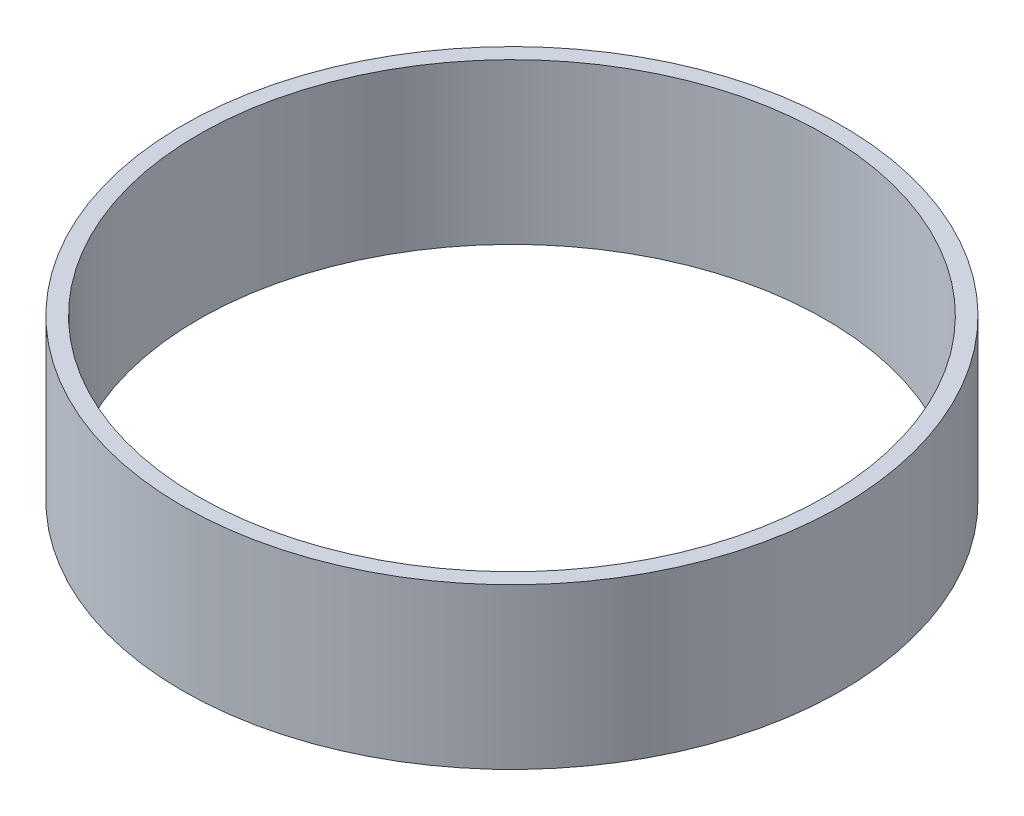
ISO-10303-21;
HEADER;
FILE_DESCRIPTION(('STEP AP214'),'2;1');
FILE_NAME('part.step','',(''),(''),'','','');
FILE_SCHEMA(('AUTOMOTIVE_DESIGN { 1 0 10303 214 1 1 1 1 }'));
ENDSEC;
DATA;
#1=APPLICATION_CONTEXT('core data for automotive mechanical design processes');
#2=APPLICATION_PROTOCOL_DEFINITION('international standard','automotive_design',2000,#1);
#3=PRODUCT_CONTEXT('',#1,'mechanical');
#4=PRODUCT('Part','Part','',(#3));
#5=PRODUCT_RELATED_PRODUCT_CATEGORY('part','',(#4));
#6=PRODUCT_DEFINITION_FORMATION('','',#4);
#7=PRODUCT_DEFINITION_CONTEXT('part definition',#1,'design');
#8=PRODUCT_DEFINITION('design','',#6,#7);
#9=PRODUCT_DEFINITION_SHAPE('','',#8);
#10=(LENGTH_UNIT() NAMED_UNIT(*) SI_UNIT(.MILLI.,.METRE.));
#11=(NAMED_UNIT(*) PLANE_ANGLE_UNIT() SI_UNIT($,.RADIAN.));
#12=(NAMED_UNIT(*) SI_UNIT($,.STERADIAN.) SOLID_ANGLE_UNIT());
#13=UNCERTAINTY_MEASURE_WITH_UNIT(LENGTH_MEASURE(1.E-05),#10,'distance_accuracy_value','');
#14=(GEOMETRIC_REPRESENTATION_CONTEXT(3) GLOBAL_UNCERTAINTY_ASSIGNED_CONTEXT((#13)) GLOBAL_UNIT_ASSIGNED_CONTEXT((#10,
#11,#12)) REPRESENTATION_CONTEXT('',''));
#15=CARTESIAN_POINT('',(0.,0.,0.));
#16=DIRECTION('',(0.,0.,1.));
#17=DIRECTION('',(1.,0.,0.));
#18=AXIS2_PLACEMENT_3D('',#15,#16,#17);
#19=CARTESIAN_POINT('',(0.,20.,0.));
#20=DIRECTION('',(0.,1.,0.));
#21=DIRECTION('',(0.,0.,1.));
#22=AXIS2_PLACEMENT_3D('',#19,#20,#21);
#23=PLANE('',#22);
#24=CARTESIAN_POINT('',(0.,20.,0.));
#25=DIRECTION('',(0.,1.,0.));
#26=DIRECTION('',(0.,0.,1.));
#27=AXIS2_PLACEMENT_3D('',#24,#25,#26);
#28=CIRCLE('',#27,41.2);
#29=CARTESIAN_POINT('',(0.,20.,41.2));
#30=VERTEX_POINT('',#29);
#31=EDGE_CURVE('E10',#30,#30,#28,.T.);
#32=ORIENTED_EDGE('',*,*,#31,.T.);
#33=EDGE_LOOP('',(#32));
#34=FACE_BOUND('',#33,.T.);
#35=CARTESIAN_POINT('',(0.,20.,0.));
#36=DIRECTION('',(0.,1.,0.));
#37=DIRECTION('',(0.,0.,1.));
#38=AXIS2_PLACEMENT_3D('',#35,#36,#37);
#39=CIRCLE('',#38,39.2);
#40=CARTESIAN_POINT('',(0.,20.,39.2));
#41=VERTEX_POINT('',#40);
#42=EDGE_CURVE('E42',#41,#41,#39,.T.);
#43=ORIENTED_EDGE('',*,*,#42,.F.);
#44=EDGE_LOOP('',(#43));
#45=FACE_BOUND('',#44,.T.);
#46=ADVANCED_FACE('F31',(#34,#45),#23,.T.);
#47=CARTESIAN_POINT('',(0.,0.,0.));
#48=DIRECTION('',(0.,1.,0.));
#49=DIRECTION('',(0.,0.,1.));
#50=AXIS2_PLACEMENT_3D('',#47,#48,#49);
#51=PLANE('',#50);
#52=CARTESIAN_POINT('',(0.,0.,0.));
#53=DIRECTION('',(0.,1.,0.));
#54=DIRECTION('',(0.,0.,1.));
#55=AXIS2_PLACEMENT_3D('',#52,#53,#54);
#56=CIRCLE('',#55,41.2);
#57=CARTESIAN_POINT('',(0.,0.,41.2));
#58=VERTEX_POINT('',#57);
#59=EDGE_CURVE('E35',#58,#58,#56,.T.);
#60=ORIENTED_EDGE('',*,*,#59,.F.);
#61=EDGE_LOOP('',(#60));
#62=FACE_BOUND('',#61,.T.);
#63=CARTESIAN_POINT('',(0.,0.,0.));
#64=DIRECTION('',(0.,1.,0.));
#65=DIRECTION('',(0.,0.,1.));
#66=AXIS2_PLACEMENT_3D('',#63,#64,#65);
#67=CIRCLE('',#66,39.2);
#68=CARTESIAN_POINT('',(0.,0.,39.2));
#69=VERTEX_POINT('',#68);
#70=EDGE_CURVE('E44',#69,#69,#67,.T.);
#71=ORIENTED_EDGE('',*,*,#70,.T.);
#72=EDGE_LOOP('',(#71));
#73=FACE_BOUND('',#72,.T.);
#74=ADVANCED_FACE('F54',(#62,#73),#51,.F.);
#75=CARTESIAN_POINT('',(0.,20.,0.));
#76=DIRECTION('',(0.,-1.,0.));
#77=DIRECTION('',(0.,0.,-1.));
#78=AXIS2_PLACEMENT_3D('',#75,#76,#77);
#79=CYLINDRICAL_SURFACE('',#78,41.2);
#80=ORIENTED_EDGE('',*,*,#31,.F.);
#81=EDGE_LOOP('',(#80));
#82=FACE_BOUND('',#81,.T.);
#83=ORIENTED_EDGE('',*,*,#59,.T.);
#84=EDGE_LOOP('',(#83));
#85=FACE_BOUND('',#84,.T.);
#86=ADVANCED_FACE('F33',(#82,#85),#79,.T.);
#87=CARTESIAN_POINT('',(0.,20.,0.));
#88=DIRECTION('',(0.,-1.,0.));
#89=DIRECTION('',(0.,0.,-1.));
#90=AXIS2_PLACEMENT_3D('',#87,#88,#89);
#91=CYLINDRICAL_SURFACE('',#90,39.2);
#92=ORIENTED_EDGE('',*,*,#42,.T.);
#93=EDGE_LOOP('',(#92));
#94=FACE_BOUND('',#93,.T.);
#95=ORIENTED_EDGE('',*,*,#70,.F.);
#96=EDGE_LOOP('',(#95));
#97=FACE_BOUND('',#96,.T.);
#98=ADVANCED_FACE('F50',(#94,#97),#91,.F.);
#99=CLOSED_SHELL('',(#46,#74,#86,#98));
#100=MANIFOLD_SOLID_BREP('B2',#99);
#101=ADVANCED_BREP_SHAPE_REPRESENTATION('',(#18,#100),#14);
#102=SHAPE_DEFINITION_REPRESENTATION(#9,#101);
ENDSEC;
END-ISO-10303-21;
